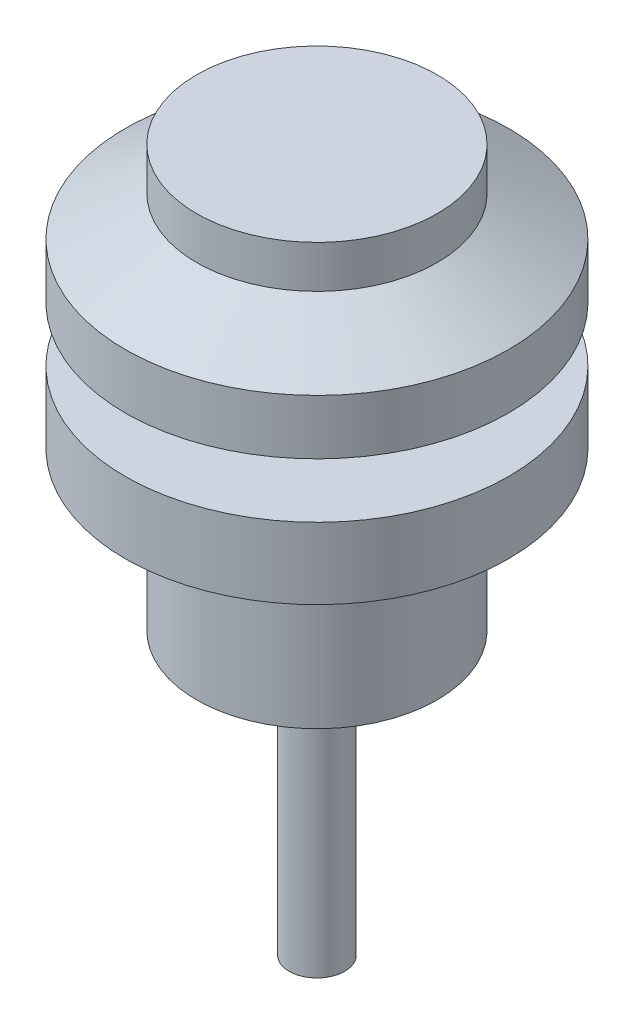
ISO-10303-21;
HEADER;
FILE_DESCRIPTION(('STEP AP214'),'2;1');
FILE_NAME('part.step','',(''),(''),'','','');
FILE_SCHEMA(('AUTOMOTIVE_DESIGN { 1 0 10303 214 1 1 1 1 }'));
ENDSEC;
DATA;
#1=APPLICATION_CONTEXT('core data for automotive mechanical design processes');
#2=APPLICATION_PROTOCOL_DEFINITION('international standard','automotive_design',2000,#1);
#3=PRODUCT_CONTEXT('',#1,'mechanical');
#4=PRODUCT('Part','Part','',(#3));
#5=PRODUCT_RELATED_PRODUCT_CATEGORY('part','',(#4));
#6=PRODUCT_DEFINITION_FORMATION('','',#4);
#7=PRODUCT_DEFINITION_CONTEXT('part definition',#1,'design');
#8=PRODUCT_DEFINITION('design','',#6,#7);
#9=PRODUCT_DEFINITION_SHAPE('','',#8);
#10=(LENGTH_UNIT() NAMED_UNIT(*) SI_UNIT(.MILLI.,.METRE.));
#11=(NAMED_UNIT(*) PLANE_ANGLE_UNIT() SI_UNIT($,.RADIAN.));
#12=(NAMED_UNIT(*) SI_UNIT($,.STERADIAN.) SOLID_ANGLE_UNIT());
#13=UNCERTAINTY_MEASURE_WITH_UNIT(LENGTH_MEASURE(1.E-05),#10,'distance_accuracy_value','');
#14=(GEOMETRIC_REPRESENTATION_CONTEXT(3) GLOBAL_UNCERTAINTY_ASSIGNED_CONTEXT((#13)) GLOBAL_UNIT_ASSIGNED_CONTEXT((#10,
#11,#12)) REPRESENTATION_CONTEXT('',''));
#15=CARTESIAN_POINT('',(0.,0.,0.));
#16=DIRECTION('',(0.,0.,1.));
#17=DIRECTION('',(1.,0.,0.));
#18=AXIS2_PLACEMENT_3D('',#15,#16,#17);
#19=CARTESIAN_POINT('',(0.,0.,0.));
#20=DIRECTION('',(0.,-1.,0.));
#21=DIRECTION('',(1.,0.,0.));
#22=AXIS2_PLACEMENT_3D('',#19,#20,#21);
#23=PLANE('',#22);
#24=CARTESIAN_POINT('',(0.,0.,0.));
#25=DIRECTION('',(0.,-1.,0.));
#26=DIRECTION('',(1.,0.,0.));
#27=AXIS2_PLACEMENT_3D('',#24,#25,#26);
#28=CIRCLE('',#27,1.016);
#29=CARTESIAN_POINT('',(1.016,0.,0.));
#30=VERTEX_POINT('',#29);
#31=EDGE_CURVE('E18',#30,#30,#28,.F.);
#32=ORIENTED_EDGE('',*,*,#31,.F.);
#33=EDGE_LOOP('',(#32));
#34=FACE_BOUND('',#33,.T.);
#35=ADVANCED_FACE('F15',(#34),#23,.T.);
#36=CARTESIAN_POINT('',(0.,26.9367,0.));
#37=DIRECTION('',(0.,-1.,0.));
#38=DIRECTION('',(1.,0.,0.));
#39=AXIS2_PLACEMENT_3D('',#36,#37,#38);
#40=CYLINDRICAL_SURFACE('',#39,1.016);
#41=ORIENTED_EDGE('',*,*,#31,.T.);
#42=EDGE_LOOP('',(#41));
#43=FACE_BOUND('',#42,.T.);
#44=CARTESIAN_POINT('',(0.,10.27303,0.));
#45=DIRECTION('',(0.,-1.,0.));
#46=DIRECTION('',(1.,0.,0.));
#47=AXIS2_PLACEMENT_3D('',#44,#45,#46);
#48=CIRCLE('',#47,1.016);
#49=CARTESIAN_POINT('',(1.016,10.27303,0.));
#50=VERTEX_POINT('',#49);
#51=EDGE_CURVE('E50',#50,#50,#48,.F.);
#52=ORIENTED_EDGE('',*,*,#51,.F.);
#53=EDGE_LOOP('',(#52));
#54=FACE_BOUND('',#53,.T.);
#55=ADVANCED_FACE('F57',(#43,#54),#40,.T.);
#56=CARTESIAN_POINT('',(0.,10.27303,0.));
#57=DIRECTION('',(0.,-1.,0.));
#58=DIRECTION('',(1.,0.,0.));
#59=AXIS2_PLACEMENT_3D('',#56,#57,#58);
#60=PLANE('',#59);
#61=ORIENTED_EDGE('',*,*,#51,.T.);
#62=EDGE_LOOP('',(#61));
#63=FACE_BOUND('',#62,.T.);
#64=CARTESIAN_POINT('',(0.,10.27303,0.));
#65=DIRECTION('',(0.,-1.,0.));
#66=DIRECTION('',(1.,0.,0.));
#67=AXIS2_PLACEMENT_3D('',#64,#65,#66);
#68=CIRCLE('',#67,4.3942);
#69=CARTESIAN_POINT('',(4.3942,10.27303,0.));
#70=VERTEX_POINT('',#69);
#71=EDGE_CURVE('E48',#70,#70,#68,.F.);
#72=ORIENTED_EDGE('',*,*,#71,.F.);
#73=EDGE_LOOP('',(#72));
#74=FACE_BOUND('',#73,.T.);
#75=ADVANCED_FACE('F65',(#63,#74),#60,.T.);
#76=CARTESIAN_POINT('',(0.,26.9367,0.));
#77=DIRECTION('',(0.,-1.,0.));
#78=DIRECTION('',(1.,0.,0.));
#79=AXIS2_PLACEMENT_3D('',#76,#77,#78);
#80=CYLINDRICAL_SURFACE('',#79,4.3942);
#81=ORIENTED_EDGE('',*,*,#71,.T.);
#82=EDGE_LOOP('',(#81));
#83=FACE_BOUND('',#82,.T.);
#84=CARTESIAN_POINT('',(0.,16.03883,0.));
#85=DIRECTION('',(0.,-1.,0.));
#86=DIRECTION('',(1.,0.,0.));
#87=AXIS2_PLACEMENT_3D('',#84,#85,#86);
#88=CIRCLE('',#87,4.3942);
#89=CARTESIAN_POINT('',(4.3942,16.03883,0.));
#90=VERTEX_POINT('',#89);
#91=EDGE_CURVE('E45',#90,#90,#88,.F.);
#92=ORIENTED_EDGE('',*,*,#91,.F.);
#93=EDGE_LOOP('',(#92));
#94=FACE_BOUND('',#93,.T.);
#95=ADVANCED_FACE('F104',(#83,#94),#80,.T.);
#96=CARTESIAN_POINT('',(0.,25.654,0.));
#97=DIRECTION('',(0.,-1.,0.));
#98=DIRECTION('',(1.,0.,0.));
#99=AXIS2_PLACEMENT_3D('',#96,#97,#98);
#100=PLANE('',#99);
#101=CARTESIAN_POINT('',(0.,25.654,0.));
#102=DIRECTION('',(0.,-1.,0.));
#103=DIRECTION('',(1.,0.,0.));
#104=AXIS2_PLACEMENT_3D('',#101,#102,#103);
#105=CIRCLE('',#104,4.3942);
#106=CARTESIAN_POINT('',(4.3942,25.654,0.));
#107=VERTEX_POINT('',#106);
#108=EDGE_CURVE('E42',#107,#107,#105,.T.);
#109=ORIENTED_EDGE('',*,*,#108,.F.);
#110=EDGE_LOOP('',(#109));
#111=FACE_BOUND('',#110,.T.);
#112=ADVANCED_FACE('F100',(#111),#100,.F.);
#113=CARTESIAN_POINT('',(0.,16.03883,0.));
#114=DIRECTION('',(0.,-1.,0.));
#115=DIRECTION('',(1.,0.,0.));
#116=AXIS2_PLACEMENT_3D('',#113,#114,#115);
#117=PLANE('',#116);
#118=ORIENTED_EDGE('',*,*,#91,.T.);
#119=EDGE_LOOP('',(#118));
#120=FACE_BOUND('',#119,.T.);
#121=CARTESIAN_POINT('',(0.,16.03883,0.));
#122=DIRECTION('',(0.,-1.,0.));
#123=DIRECTION('',(1.,0.,0.));
#124=AXIS2_PLACEMENT_3D('',#121,#122,#123);
#125=CIRCLE('',#124,6.99897);
#126=CARTESIAN_POINT('',(6.99897,16.03883,0.));
#127=VERTEX_POINT('',#126);
#128=EDGE_CURVE('E39',#127,#127,#125,.F.);
#129=ORIENTED_EDGE('',*,*,#128,.F.);
#130=EDGE_LOOP('',(#129));
#131=FACE_BOUND('',#130,.T.);
#132=ADVANCED_FACE('F96',(#120,#131),#117,.T.);
#133=CARTESIAN_POINT('',(0.,26.9367,0.));
#134=DIRECTION('',(0.,-1.,0.));
#135=DIRECTION('',(1.,0.,0.));
#136=AXIS2_PLACEMENT_3D('',#133,#134,#135);
#137=CYLINDRICAL_SURFACE('',#136,4.3942);
#138=ORIENTED_EDGE('',*,*,#108,.T.);
#139=EDGE_LOOP('',(#138));
#140=FACE_BOUND('',#139,.T.);
#141=CARTESIAN_POINT('',(0.,24.1046,0.));
#142=DIRECTION('',(0.,-1.,0.));
#143=DIRECTION('',(-1.,0.,0.));
#144=AXIS2_PLACEMENT_3D('',#141,#142,#143);
#145=CIRCLE('',#144,4.3942);
#146=CARTESIAN_POINT('',(-4.3942,24.1046,0.));
#147=VERTEX_POINT('',#146);
#148=EDGE_CURVE('E30',#147,#147,#145,.T.);
#149=ORIENTED_EDGE('',*,*,#148,.F.);
#150=EDGE_LOOP('',(#149));
#151=FACE_BOUND('',#150,.T.);
#152=ADVANCED_FACE('F92',(#140,#151),#137,.T.);
#153=CARTESIAN_POINT('',(0.,26.9367,0.));
#154=DIRECTION('',(0.,-1.,0.));
#155=DIRECTION('',(1.,0.,0.));
#156=AXIS2_PLACEMENT_3D('',#153,#154,#155);
#157=CYLINDRICAL_SURFACE('',#156,6.99897);
#158=CARTESIAN_POINT('',(0.,18.6436,0.));
#159=DIRECTION('',(0.,-1.,0.));
#160=DIRECTION('',(1.,0.,0.));
#161=AXIS2_PLACEMENT_3D('',#158,#159,#160);
#162=CIRCLE('',#161,6.99897);
#163=CARTESIAN_POINT('',(6.99897,18.6436,0.));
#164=VERTEX_POINT('',#163);
#165=EDGE_CURVE('E36',#164,#164,#162,.T.);
#166=ORIENTED_EDGE('',*,*,#165,.T.);
#167=EDGE_LOOP('',(#166));
#168=FACE_BOUND('',#167,.T.);
#169=ORIENTED_EDGE('',*,*,#128,.T.);
#170=EDGE_LOOP('',(#169));
#171=FACE_BOUND('',#170,.T.);
#172=ADVANCED_FACE('F88',(#168,#171),#157,.T.);
#173=CARTESIAN_POINT('',(0.,22.6568,0.));
#174=DIRECTION('',(0.,-1.,0.));
#175=DIRECTION('',(1.,0.,0.));
#176=AXIS2_PLACEMENT_3D('',#173,#174,#175);
#177=CONICAL_SURFACE('',#176,6.99896999999999,1.06349086019681);
#178=ORIENTED_EDGE('',*,*,#148,.T.);
#179=EDGE_LOOP('',(#178));
#180=FACE_BOUND('',#179,.T.);
#181=CARTESIAN_POINT('',(0.,22.6568,0.));
#182=DIRECTION('',(0.,-1.,0.));
#183=DIRECTION('',(1.,0.,0.));
#184=AXIS2_PLACEMENT_3D('',#181,#182,#183);
#185=CIRCLE('',#184,6.99897);
#186=CARTESIAN_POINT('',(6.99897,22.6568,0.));
#187=VERTEX_POINT('',#186);
#188=EDGE_CURVE('E35',#187,#187,#185,.T.);
#189=ORIENTED_EDGE('',*,*,#188,.F.);
#190=EDGE_LOOP('',(#189));
#191=FACE_BOUND('',#190,.T.);
#192=ADVANCED_FACE('F84',(#180,#191),#177,.T.);
#193=CARTESIAN_POINT('',(0.,18.6436,0.));
#194=DIRECTION('',(0.,-1.,0.));
#195=DIRECTION('',(1.,0.,0.));
#196=AXIS2_PLACEMENT_3D('',#193,#194,#195);
#197=PLANE('',#196);
#198=CARTESIAN_POINT('',(0.,18.6436,0.));
#199=DIRECTION('',(0.,-1.,0.));
#200=DIRECTION('',(1.,0.,0.));
#201=AXIS2_PLACEMENT_3D('',#198,#199,#200);
#202=CIRCLE('',#201,4.03022678939314);
#203=CARTESIAN_POINT('',(4.03022678939314,18.6436,0.));
#204=VERTEX_POINT('',#203);
#205=EDGE_CURVE('E27',#204,#204,#202,.F.);
#206=ORIENTED_EDGE('',*,*,#205,.F.);
#207=EDGE_LOOP('',(#206));
#208=FACE_BOUND('',#207,.T.);
#209=ORIENTED_EDGE('',*,*,#165,.F.);
#210=EDGE_LOOP('',(#209));
#211=FACE_BOUND('',#210,.T.);
#212=ADVANCED_FACE('F80',(#208,#211),#197,.F.);
#213=CARTESIAN_POINT('',(0.,26.9367,0.));
#214=DIRECTION('',(0.,-1.,0.));
#215=DIRECTION('',(1.,0.,0.));
#216=AXIS2_PLACEMENT_3D('',#213,#214,#215);
#217=CYLINDRICAL_SURFACE('',#216,6.99897);
#218=ORIENTED_EDGE('',*,*,#188,.T.);
#219=EDGE_LOOP('',(#218));
#220=FACE_BOUND('',#219,.T.);
#221=CARTESIAN_POINT('',(0.,20.6502,0.));
#222=DIRECTION('',(0.,-1.,0.));
#223=DIRECTION('',(1.,0.,0.));
#224=AXIS2_PLACEMENT_3D('',#221,#222,#223);
#225=CIRCLE('',#224,6.99897);
#226=CARTESIAN_POINT('',(6.99897,20.6502,0.));
#227=VERTEX_POINT('',#226);
#228=EDGE_CURVE('E22',#227,#227,#225,.T.);
#229=ORIENTED_EDGE('',*,*,#228,.F.);
#230=EDGE_LOOP('',(#229));
#231=FACE_BOUND('',#230,.T.);
#232=ADVANCED_FACE('F73',(#220,#231),#217,.T.);
#233=CARTESIAN_POINT('',(0.,26.9367,0.));
#234=DIRECTION('',(0.,-1.,0.));
#235=DIRECTION('',(1.,0.,0.));
#236=AXIS2_PLACEMENT_3D('',#233,#234,#235);
#237=CYLINDRICAL_SURFACE('',#236,4.03022678939314);
#238=ORIENTED_EDGE('',*,*,#205,.T.);
#239=EDGE_LOOP('',(#238));
#240=FACE_BOUND('',#239,.T.);
#241=CARTESIAN_POINT('',(0.,20.6502,0.));
#242=DIRECTION('',(0.,-1.,0.));
#243=DIRECTION('',(1.,0.,0.));
#244=AXIS2_PLACEMENT_3D('',#241,#242,#243);
#245=CIRCLE('',#244,4.03022678939314);
#246=CARTESIAN_POINT('',(4.03022678939314,20.6502,0.));
#247=VERTEX_POINT('',#246);
#248=EDGE_CURVE('E10',#247,#247,#245,.F.);
#249=ORIENTED_EDGE('',*,*,#248,.F.);
#250=EDGE_LOOP('',(#249));
#251=FACE_BOUND('',#250,.T.);
#252=ADVANCED_FACE('F68',(#240,#251),#237,.T.);
#253=CARTESIAN_POINT('',(0.,20.6502,0.));
#254=DIRECTION('',(0.,-1.,0.));
#255=DIRECTION('',(1.,0.,0.));
#256=AXIS2_PLACEMENT_3D('',#253,#254,#255);
#257=PLANE('',#256);
#258=ORIENTED_EDGE('',*,*,#248,.T.);
#259=EDGE_LOOP('',(#258));
#260=FACE_BOUND('',#259,.T.);
#261=ORIENTED_EDGE('',*,*,#228,.T.);
#262=EDGE_LOOP('',(#261));
#263=FACE_BOUND('',#262,.T.);
#264=ADVANCED_FACE('F66',(#260,#263),#257,.T.);
#265=CLOSED_SHELL('',(#35,#55,#75,#95,#112,#132,#152,#172,#192,#212,#232,#252,#264));
#266=MANIFOLD_SOLID_BREP('B1',#265);
#267=ADVANCED_BREP_SHAPE_REPRESENTATION('',(#18,#266),#14);
#268=SHAPE_DEFINITION_REPRESENTATION(#9,#267);
ENDSEC;
END-ISO-10303-21;
